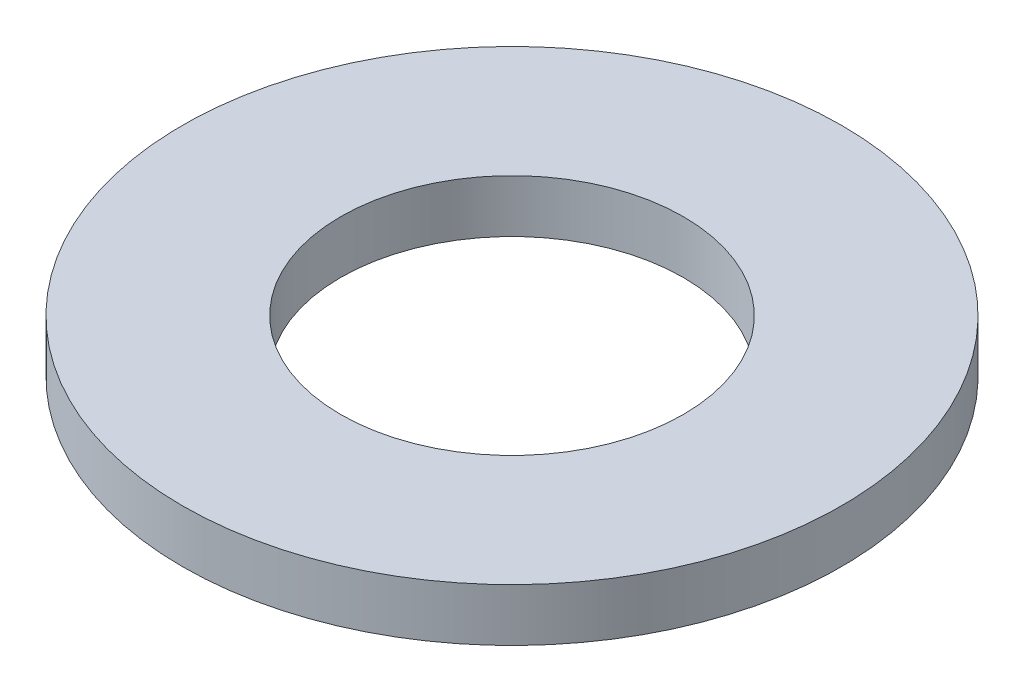
ISO-10303-21;
HEADER;
FILE_DESCRIPTION(('STEP AP214'),'2;1');
FILE_NAME('part.step','',(''),(''),'','','');
FILE_SCHEMA(('AUTOMOTIVE_DESIGN { 1 0 10303 214 1 1 1 1 }'));
ENDSEC;
DATA;
#1=APPLICATION_CONTEXT('core data for automotive mechanical design processes');
#2=APPLICATION_PROTOCOL_DEFINITION('international standard','automotive_design',2000,#1);
#3=PRODUCT_CONTEXT('',#1,'mechanical');
#4=PRODUCT('Part','Part','',(#3));
#5=PRODUCT_RELATED_PRODUCT_CATEGORY('part','',(#4));
#6=PRODUCT_DEFINITION_FORMATION('','',#4);
#7=PRODUCT_DEFINITION_CONTEXT('part definition',#1,'design');
#8=PRODUCT_DEFINITION('design','',#6,#7);
#9=PRODUCT_DEFINITION_SHAPE('','',#8);
#10=(LENGTH_UNIT() NAMED_UNIT(*) SI_UNIT(.MILLI.,.METRE.));
#11=(NAMED_UNIT(*) PLANE_ANGLE_UNIT() SI_UNIT($,.RADIAN.));
#12=(NAMED_UNIT(*) SI_UNIT($,.STERADIAN.) SOLID_ANGLE_UNIT());
#13=UNCERTAINTY_MEASURE_WITH_UNIT(LENGTH_MEASURE(1.E-05),#10,'distance_accuracy_value','');
#14=(GEOMETRIC_REPRESENTATION_CONTEXT(3) GLOBAL_UNCERTAINTY_ASSIGNED_CONTEXT((#13)) GLOBAL_UNIT_ASSIGNED_CONTEXT((#10,
#11,#12)) REPRESENTATION_CONTEXT('',''));
#15=CARTESIAN_POINT('',(0.,0.,0.));
#16=DIRECTION('',(0.,0.,1.));
#17=DIRECTION('',(1.,0.,0.));
#18=AXIS2_PLACEMENT_3D('',#15,#16,#17);
#19=CARTESIAN_POINT('',(0.,1.524,0.));
#20=DIRECTION('',(0.,1.,0.));
#21=DIRECTION('',(0.,0.,1.));
#22=AXIS2_PLACEMENT_3D('',#19,#20,#21);
#23=PLANE('',#22);
#24=CARTESIAN_POINT('',(0.,1.524,0.));
#25=DIRECTION('',(0.,1.,0.));
#26=DIRECTION('',(0.,0.,1.));
#27=AXIS2_PLACEMENT_3D('',#24,#25,#26);
#28=CIRCLE('',#27,9.525);
#29=CARTESIAN_POINT('',(0.,1.524,-9.525));
#30=VERTEX_POINT('',#29);
#31=EDGE_CURVE('E10',#30,#30,#28,.T.);
#32=ORIENTED_EDGE('',*,*,#31,.T.);
#33=EDGE_LOOP('',(#32));
#34=FACE_BOUND('',#33,.T.);
#35=CARTESIAN_POINT('',(0.,1.524,0.));
#36=DIRECTION('',(0.,1.,0.));
#37=DIRECTION('',(0.,0.,1.));
#38=AXIS2_PLACEMENT_3D('',#35,#36,#37);
#39=CIRCLE('',#38,4.953);
#40=CARTESIAN_POINT('',(0.,1.524,-4.953));
#41=VERTEX_POINT('',#40);
#42=EDGE_CURVE('E45',#41,#41,#39,.T.);
#43=ORIENTED_EDGE('',*,*,#42,.F.);
#44=EDGE_LOOP('',(#43));
#45=FACE_BOUND('',#44,.T.);
#46=ADVANCED_FACE('F34',(#34,#45),#23,.T.);
#47=CARTESIAN_POINT('',(0.,0.,0.));
#48=DIRECTION('',(0.,1.,0.));
#49=DIRECTION('',(0.,0.,1.));
#50=AXIS2_PLACEMENT_3D('',#47,#48,#49);
#51=PLANE('',#50);
#52=CARTESIAN_POINT('',(0.,0.,0.));
#53=DIRECTION('',(0.,1.,0.));
#54=DIRECTION('',(0.,0.,1.));
#55=AXIS2_PLACEMENT_3D('',#52,#53,#54);
#56=CIRCLE('',#55,9.525);
#57=CARTESIAN_POINT('',(0.,0.,-9.525));
#58=VERTEX_POINT('',#57);
#59=EDGE_CURVE('E38',#58,#58,#56,.T.);
#60=ORIENTED_EDGE('',*,*,#59,.F.);
#61=EDGE_LOOP('',(#60));
#62=FACE_BOUND('',#61,.T.);
#63=CARTESIAN_POINT('',(0.,0.,0.));
#64=DIRECTION('',(0.,1.,0.));
#65=DIRECTION('',(0.,0.,1.));
#66=AXIS2_PLACEMENT_3D('',#63,#64,#65);
#67=CIRCLE('',#66,4.953);
#68=CARTESIAN_POINT('',(0.,0.,-4.953));
#69=VERTEX_POINT('',#68);
#70=EDGE_CURVE('E47',#69,#69,#67,.T.);
#71=ORIENTED_EDGE('',*,*,#70,.T.);
#72=EDGE_LOOP('',(#71));
#73=FACE_BOUND('',#72,.T.);
#74=ADVANCED_FACE('F57',(#62,#73),#51,.F.);
#75=CARTESIAN_POINT('',(0.,1.524,0.));
#76=DIRECTION('',(0.,-1.,0.));
#77=DIRECTION('',(0.,0.,-1.));
#78=AXIS2_PLACEMENT_3D('',#75,#76,#77);
#79=CYLINDRICAL_SURFACE('',#78,9.525);
#80=CARTESIAN_POINT('',(0.,1.524,-9.525));
#81=CARTESIAN_POINT('',(0.,1.508125,-9.525));
#82=CARTESIAN_POINT('',(0.,1.49225,-9.525));
#83=CARTESIAN_POINT('',(0.,1.4605,-9.525));
#84=CARTESIAN_POINT('',(0.,1.444625,-9.525));
#85=CARTESIAN_POINT('',(0.,1.412875,-9.525));
#86=CARTESIAN_POINT('',(0.,1.397,-9.525));
#87=CARTESIAN_POINT('',(0.,1.36525,-9.525));
#88=CARTESIAN_POINT('',(0.,1.349375,-9.525));
#89=CARTESIAN_POINT('',(0.,1.317625,-9.525));
#90=CARTESIAN_POINT('',(0.,1.30175,-9.525));
#91=CARTESIAN_POINT('',(0.,1.27,-9.525));
#92=CARTESIAN_POINT('',(0.,1.254125,-9.525));
#93=CARTESIAN_POINT('',(0.,1.222375,-9.525));
#94=CARTESIAN_POINT('',(0.,1.2065,-9.525));
#95=CARTESIAN_POINT('',(0.,1.17475,-9.525));
#96=CARTESIAN_POINT('',(0.,1.158875,-9.525));
#97=CARTESIAN_POINT('',(0.,1.127125,-9.525));
#98=CARTESIAN_POINT('',(0.,1.11125,-9.525));
#99=CARTESIAN_POINT('',(0.,1.0795,-9.525));
#100=CARTESIAN_POINT('',(0.,1.063625,-9.525));
#101=CARTESIAN_POINT('',(0.,1.031875,-9.525));
#102=CARTESIAN_POINT('',(0.,1.016,-9.525));
#103=CARTESIAN_POINT('',(0.,0.98425,-9.525));
#104=CARTESIAN_POINT('',(0.,0.968375,-9.525));
#105=CARTESIAN_POINT('',(0.,0.936625,-9.525));
#106=CARTESIAN_POINT('',(0.,0.92075,-9.525));
#107=CARTESIAN_POINT('',(0.,0.889,-9.525));
#108=CARTESIAN_POINT('',(0.,0.873125,-9.525));
#109=CARTESIAN_POINT('',(0.,0.841375,-9.525));
#110=CARTESIAN_POINT('',(0.,0.8255,-9.525));
#111=CARTESIAN_POINT('',(0.,0.79375,-9.525));
#112=CARTESIAN_POINT('',(0.,0.777875,-9.525));
#113=CARTESIAN_POINT('',(0.,0.746125,-9.525));
#114=CARTESIAN_POINT('',(0.,0.73025,-9.525));
#115=CARTESIAN_POINT('',(0.,0.6985,-9.525));
#116=CARTESIAN_POINT('',(0.,0.682625,-9.525));
#117=CARTESIAN_POINT('',(0.,0.650875,-9.525));
#118=CARTESIAN_POINT('',(0.,0.635,-9.525));
#119=CARTESIAN_POINT('',(0.,0.60325,-9.525));
#120=CARTESIAN_POINT('',(0.,0.587375,-9.525));
#121=CARTESIAN_POINT('',(0.,0.555625,-9.525));
#122=CARTESIAN_POINT('',(0.,0.53975,-9.525));
#123=CARTESIAN_POINT('',(0.,0.508,-9.525));
#124=CARTESIAN_POINT('',(0.,0.492125,-9.525));
#125=CARTESIAN_POINT('',(0.,0.460375,-9.525));
#126=CARTESIAN_POINT('',(0.,0.4445,-9.525));
#127=CARTESIAN_POINT('',(0.,0.41275,-9.525));
#128=CARTESIAN_POINT('',(0.,0.396875,-9.525));
#129=CARTESIAN_POINT('',(0.,0.365125,-9.525));
#130=CARTESIAN_POINT('',(0.,0.34925,-9.525));
#131=CARTESIAN_POINT('',(0.,0.3175,-9.525));
#132=CARTESIAN_POINT('',(0.,0.301625,-9.525));
#133=CARTESIAN_POINT('',(0.,0.269875,-9.525));
#134=CARTESIAN_POINT('',(0.,0.254,-9.525));
#135=CARTESIAN_POINT('',(0.,0.22225,-9.525));
#136=CARTESIAN_POINT('',(0.,0.206375,-9.525));
#137=CARTESIAN_POINT('',(0.,0.174625,-9.525));
#138=CARTESIAN_POINT('',(0.,0.15875,-9.525));
#139=CARTESIAN_POINT('',(0.,0.127,-9.525));
#140=CARTESIAN_POINT('',(0.,0.111125,-9.525));
#141=CARTESIAN_POINT('',(0.,0.079375,-9.525));
#142=CARTESIAN_POINT('',(0.,0.0635,-9.525));
#143=CARTESIAN_POINT('',(0.,0.0317499999999999,-9.525));
#144=CARTESIAN_POINT('',(0.,0.015875,-9.525));
#145=CARTESIAN_POINT('',(0.,0.,-9.525));
#146=B_SPLINE_CURVE_WITH_KNOTS('',3,(#80,#81,#82,#83,#84,#85,#86,#87,#88,#89,#90,#91,#92,#93,
#94,#95,#96,#97,#98,#99,#100,#101,#102,#103,#104,#105,#106,#107,#108,#109,#110,#111,#112,#113,
#114,#115,#116,#117,#118,#119,#120,#121,#122,#123,#124,#125,#126,#127,#128,#129,#130,#131,#132,
#133,#134,#135,#136,#137,#138,#139,#140,#141,#142,#143,#144,#145),.UNSPECIFIED.,.F.,.F.,(4,2,2,
2,2,2,2,2,2,2,2,2,2,2,2,2,2,2,2,2,2,2,2,2,2,2,2,2,2,2,2,2,4),(0.,0.0476250000000001,
0.0952500000000001,0.142875,0.1905,0.238125,0.28575,0.333375,0.381,0.428625,0.47625,0.523875,
0.5715,0.619125,0.66675,0.714375,0.762,0.809625,0.85725,0.904875,0.9525,1.000125,1.04775,
1.095375,1.143,1.190625,1.23825,1.285875,1.3335,1.381125,1.42875,1.476375,1.524),.UNSPECIFIED.);
#147=EDGE_CURVE('BSEAM36',#30,#58,#146,.T.);
#148=ORIENTED_EDGE('',*,*,#31,.F.);
#149=ORIENTED_EDGE('',*,*,#59,.T.);
#150=ORIENTED_EDGE('',*,*,#147,.T.);
#151=ORIENTED_EDGE('',*,*,#147,.F.);
#152=EDGE_LOOP('',(#148,#150,#149,#151));
#153=FACE_BOUND('',#152,.T.);
#154=ADVANCED_FACE('F36',(#153),#79,.T.);
#155=CARTESIAN_POINT('',(0.,1.524,0.));
#156=DIRECTION('',(0.,-1.,0.));
#157=DIRECTION('',(0.,0.,-1.));
#158=AXIS2_PLACEMENT_3D('',#155,#156,#157);
#159=CYLINDRICAL_SURFACE('',#158,4.953);
#160=CARTESIAN_POINT('',(0.,1.524,-4.953));
#161=CARTESIAN_POINT('',(0.,1.508125,-4.953));
#162=CARTESIAN_POINT('',(0.,1.49225,-4.953));
#163=CARTESIAN_POINT('',(0.,1.4605,-4.953));
#164=CARTESIAN_POINT('',(0.,1.444625,-4.953));
#165=CARTESIAN_POINT('',(0.,1.412875,-4.953));
#166=CARTESIAN_POINT('',(0.,1.397,-4.953));
#167=CARTESIAN_POINT('',(0.,1.36525,-4.953));
#168=CARTESIAN_POINT('',(0.,1.349375,-4.953));
#169=CARTESIAN_POINT('',(0.,1.317625,-4.953));
#170=CARTESIAN_POINT('',(0.,1.30175,-4.953));
#171=CARTESIAN_POINT('',(0.,1.27,-4.953));
#172=CARTESIAN_POINT('',(0.,1.254125,-4.953));
#173=CARTESIAN_POINT('',(0.,1.222375,-4.953));
#174=CARTESIAN_POINT('',(0.,1.2065,-4.953));
#175=CARTESIAN_POINT('',(0.,1.17475,-4.953));
#176=CARTESIAN_POINT('',(0.,1.158875,-4.953));
#177=CARTESIAN_POINT('',(0.,1.127125,-4.953));
#178=CARTESIAN_POINT('',(0.,1.11125,-4.953));
#179=CARTESIAN_POINT('',(0.,1.0795,-4.953));
#180=CARTESIAN_POINT('',(0.,1.063625,-4.953));
#181=CARTESIAN_POINT('',(0.,1.031875,-4.953));
#182=CARTESIAN_POINT('',(0.,1.016,-4.953));
#183=CARTESIAN_POINT('',(0.,0.98425,-4.953));
#184=CARTESIAN_POINT('',(0.,0.968375,-4.953));
#185=CARTESIAN_POINT('',(0.,0.936625,-4.953));
#186=CARTESIAN_POINT('',(0.,0.92075,-4.953));
#187=CARTESIAN_POINT('',(0.,0.889,-4.953));
#188=CARTESIAN_POINT('',(0.,0.873125,-4.953));
#189=CARTESIAN_POINT('',(0.,0.841375,-4.953));
#190=CARTESIAN_POINT('',(0.,0.8255,-4.953));
#191=CARTESIAN_POINT('',(0.,0.79375,-4.953));
#192=CARTESIAN_POINT('',(0.,0.777875,-4.953));
#193=CARTESIAN_POINT('',(0.,0.746125,-4.953));
#194=CARTESIAN_POINT('',(0.,0.73025,-4.953));
#195=CARTESIAN_POINT('',(0.,0.6985,-4.953));
#196=CARTESIAN_POINT('',(0.,0.682625,-4.953));
#197=CARTESIAN_POINT('',(0.,0.650875,-4.953));
#198=CARTESIAN_POINT('',(0.,0.635,-4.953));
#199=CARTESIAN_POINT('',(0.,0.60325,-4.953));
#200=CARTESIAN_POINT('',(0.,0.587375,-4.953));
#201=CARTESIAN_POINT('',(0.,0.555625,-4.953));
#202=CARTESIAN_POINT('',(0.,0.53975,-4.953));
#203=CARTESIAN_POINT('',(0.,0.508,-4.953));
#204=CARTESIAN_POINT('',(0.,0.492125,-4.953));
#205=CARTESIAN_POINT('',(0.,0.460375,-4.953));
#206=CARTESIAN_POINT('',(0.,0.4445,-4.953));
#207=CARTESIAN_POINT('',(0.,0.41275,-4.953));
#208=CARTESIAN_POINT('',(0.,0.396875,-4.953));
#209=CARTESIAN_POINT('',(0.,0.365125,-4.953));
#210=CARTESIAN_POINT('',(0.,0.34925,-4.953));
#211=CARTESIAN_POINT('',(0.,0.3175,-4.953));
#212=CARTESIAN_POINT('',(0.,0.301625,-4.953));
#213=CARTESIAN_POINT('',(0.,0.269875,-4.953));
#214=CARTESIAN_POINT('',(0.,0.254,-4.953));
#215=CARTESIAN_POINT('',(0.,0.22225,-4.953));
#216=CARTESIAN_POINT('',(0.,0.206375,-4.953));
#217=CARTESIAN_POINT('',(0.,0.174625,-4.953));
#218=CARTESIAN_POINT('',(0.,0.15875,-4.953));
#219=CARTESIAN_POINT('',(0.,0.127,-4.953));
#220=CARTESIAN_POINT('',(0.,0.111125,-4.953));
#221=CARTESIAN_POINT('',(0.,0.079375,-4.953));
#222=CARTESIAN_POINT('',(0.,0.0635,-4.953));
#223=CARTESIAN_POINT('',(0.,0.0317499999999999,-4.953));
#224=CARTESIAN_POINT('',(0.,0.015875,-4.953));
#225=CARTESIAN_POINT('',(0.,0.,-4.953));
#226=B_SPLINE_CURVE_WITH_KNOTS('',3,(#160,#161,#162,#163,#164,#165,#166,#167,#168,#169,#170,
#171,#172,#173,#174,#175,#176,#177,#178,#179,#180,#181,#182,#183,#184,#185,#186,#187,#188,#189,
#190,#191,#192,#193,#194,#195,#196,#197,#198,#199,#200,#201,#202,#203,#204,#205,#206,#207,#208,
#209,#210,#211,#212,#213,#214,#215,#216,#217,#218,#219,#220,#221,#222,#223,#224,#225),
.UNSPECIFIED.,.F.,.F.,(4,2,2,2,2,2,2,2,2,2,2,2,2,2,2,2,2,2,2,2,2,2,2,2,2,2,2,2,2,2,2,2,4),(0.,
0.0476249999999999,0.0952499999999998,0.142875,0.1905,0.238125,0.28575,0.333375,0.381,0.428625,
0.47625,0.523875,0.5715,0.619125,0.66675,0.714375,0.762,0.809625,0.85725,0.904875,0.9525,
1.000125,1.04775,1.095375,1.143,1.190625,1.23825,1.285875,1.3335,1.381125,1.42875,1.476375,
1.524),.UNSPECIFIED.);
#227=EDGE_CURVE('BSEAM53',#41,#69,#226,.T.);
#228=ORIENTED_EDGE('',*,*,#42,.T.);
#229=ORIENTED_EDGE('',*,*,#70,.F.);
#230=ORIENTED_EDGE('',*,*,#227,.T.);
#231=ORIENTED_EDGE('',*,*,#227,.F.);
#232=EDGE_LOOP('',(#228,#230,#229,#231));
#233=FACE_BOUND('',#232,.T.);
#234=ADVANCED_FACE('F53',(#233),#159,.F.);
#235=CLOSED_SHELL('',(#46,#74,#154,#234));
#236=MANIFOLD_SOLID_BREP('B2',#235);
#237=ADVANCED_BREP_SHAPE_REPRESENTATION('',(#18,#236),#14);
#238=SHAPE_DEFINITION_REPRESENTATION(#9,#237);
ENDSEC;
END-ISO-10303-21;
